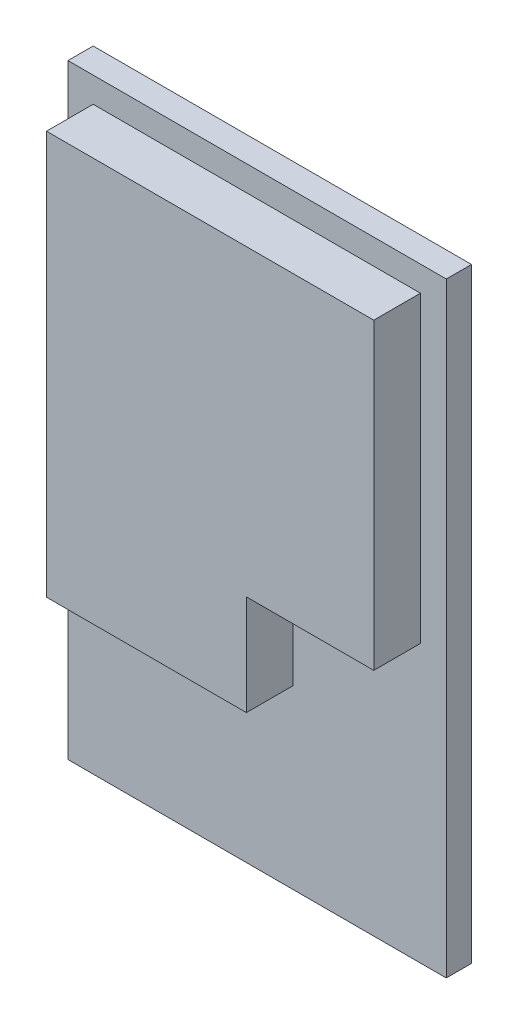
ISO-10303-21;
HEADER;
FILE_DESCRIPTION(('STEP AP214'),'2;1');
FILE_NAME('part.step','',(''),(''),'','','');
FILE_SCHEMA(('AUTOMOTIVE_DESIGN { 1 0 10303 214 1 1 1 1 }'));
ENDSEC;
DATA;
#1=APPLICATION_CONTEXT('core data for automotive mechanical design processes');
#2=APPLICATION_PROTOCOL_DEFINITION('international standard','automotive_design',2000,#1);
#3=PRODUCT_CONTEXT('',#1,'mechanical');
#4=PRODUCT('Part','Part','',(#3));
#5=PRODUCT_RELATED_PRODUCT_CATEGORY('part','',(#4));
#6=PRODUCT_DEFINITION_FORMATION('','',#4);
#7=PRODUCT_DEFINITION_CONTEXT('part definition',#1,'design');
#8=PRODUCT_DEFINITION('design','',#6,#7);
#9=PRODUCT_DEFINITION_SHAPE('','',#8);
#10=(LENGTH_UNIT() NAMED_UNIT(*) SI_UNIT(.MILLI.,.METRE.));
#11=(NAMED_UNIT(*) PLANE_ANGLE_UNIT() SI_UNIT($,.RADIAN.));
#12=(NAMED_UNIT(*) SI_UNIT($,.STERADIAN.) SOLID_ANGLE_UNIT());
#13=UNCERTAINTY_MEASURE_WITH_UNIT(LENGTH_MEASURE(1.E-05),#10,'distance_accuracy_value','');
#14=(GEOMETRIC_REPRESENTATION_CONTEXT(3) GLOBAL_UNCERTAINTY_ASSIGNED_CONTEXT((#13)) GLOBAL_UNIT_ASSIGNED_CONTEXT((#10,
#11,#12)) REPRESENTATION_CONTEXT('',''));
#15=CARTESIAN_POINT('',(0.,0.,0.));
#16=DIRECTION('',(0.,0.,1.));
#17=DIRECTION('',(1.,0.,0.));
#18=AXIS2_PLACEMENT_3D('',#15,#16,#17);
#19=CARTESIAN_POINT('',(-2.03199999981862E-05,2.69999714,0.));
#20=DIRECTION('',(0.,1.,0.));
#21=DIRECTION('',(1.,0.,0.));
#22=AXIS2_PLACEMENT_3D('',#19,#20,#21);
#23=PLANE('',#22);
#24=DIRECTION('',(0.,0.,1.));
#25=VECTOR('',#24,1.);
#26=CARTESIAN_POINT('',(-2.03199999981862E-05,2.69999714,0.));
#27=LINE('',#26,#25);
#28=CARTESIAN_POINT('',(-2.03199999981862E-05,2.69999714,0.));
#29=VERTEX_POINT('',#28);
#30=CARTESIAN_POINT('',(-2.03199999981862E-05,2.69999714,1.00000054));
#31=VERTEX_POINT('',#30);
#32=EDGE_CURVE('P0_E11',#29,#31,#27,.T.);
#33=ORIENTED_EDGE('',*,*,#32,.T.);
#34=DIRECTION('',(1.,0.,0.));
#35=VECTOR('',#34,1.);
#36=CARTESIAN_POINT('',(-2.03199999981862E-05,2.69999714,1.00000054));
#37=LINE('',#36,#35);
#38=CARTESIAN_POINT('',(14.99998016,2.69999714,1.00000054));
#39=VERTEX_POINT('',#38);
#40=EDGE_CURVE('P0_E23',#31,#39,#37,.T.);
#41=ORIENTED_EDGE('',*,*,#40,.T.);
#42=DIRECTION('',(0.,0.,1.));
#43=VECTOR('',#42,1.);
#44=CARTESIAN_POINT('',(14.99998016,2.69999714,0.));
#45=LINE('',#44,#43);
#46=CARTESIAN_POINT('',(14.99998016,2.69999714,0.));
#47=VERTEX_POINT('',#46);
#48=EDGE_CURVE('P0_E84',#47,#39,#45,.T.);
#49=ORIENTED_EDGE('',*,*,#48,.F.);
#50=DIRECTION('',(1.,0.,0.));
#51=VECTOR('',#50,1.);
#52=CARTESIAN_POINT('',(-2.03199999981862E-05,2.69999714,0.));
#53=LINE('',#52,#51);
#54=EDGE_CURVE('P0_E82',#29,#47,#53,.T.);
#55=ORIENTED_EDGE('',*,*,#54,.F.);
#56=EDGE_LOOP('',(#33,#41,#49,#55));
#57=FACE_BOUND('',#56,.T.);
#58=ADVANCED_FACE('P0_F16',(#57),#23,.T.);
#59=CARTESIAN_POINT('',(14.99998016,2.69999714,0.));
#60=DIRECTION('',(0.999999999999726,7.40833403898232E-07,0.));
#61=DIRECTION('',(7.40833403898232E-07,-0.999999999999726,0.));
#62=AXIS2_PLACEMENT_3D('',#59,#60,#61);
#63=PLANE('',#62);
#64=ORIENTED_EDGE('',*,*,#48,.T.);
#65=DIRECTION('',(7.40833403898232E-07,-0.999999999999726,0.));
#66=VECTOR('',#65,1.);
#67=CARTESIAN_POINT('',(14.99998016,2.69999714,1.00000054));
#68=LINE('',#67,#66);
#69=CARTESIAN_POINT('',(14.99999794,-21.30000058,1.00000054));
#70=VERTEX_POINT('',#69);
#71=EDGE_CURVE('P0_E80',#39,#70,#68,.T.);
#72=ORIENTED_EDGE('',*,*,#71,.T.);
#73=DIRECTION('',(0.,0.,1.));
#74=VECTOR('',#73,1.);
#75=CARTESIAN_POINT('',(14.99999794,-21.30000058,0.));
#76=LINE('',#75,#74);
#77=CARTESIAN_POINT('',(14.99999794,-21.30000058,0.));
#78=VERTEX_POINT('',#77);
#79=EDGE_CURVE('P0_E78',#78,#70,#76,.T.);
#80=ORIENTED_EDGE('',*,*,#79,.F.);
#81=DIRECTION('',(7.40833403898232E-07,-0.999999999999726,0.));
#82=VECTOR('',#81,1.);
#83=CARTESIAN_POINT('',(14.99998016,2.69999714,0.));
#84=LINE('',#83,#82);
#85=EDGE_CURVE('P0_E69',#47,#78,#84,.T.);
#86=ORIENTED_EDGE('',*,*,#85,.F.);
#87=EDGE_LOOP('',(#64,#72,#80,#86));
#88=FACE_BOUND('',#87,.T.);
#89=ADVANCED_FACE('P0_F89',(#88),#63,.T.);
#90=CARTESIAN_POINT('',(14.99999794,-21.30000058,0.));
#91=DIRECTION('',(0.,-1.,0.));
#92=DIRECTION('',(-1.,0.,0.));
#93=AXIS2_PLACEMENT_3D('',#90,#91,#92);
#94=PLANE('',#93);
#95=ORIENTED_EDGE('',*,*,#79,.T.);
#96=DIRECTION('',(-1.,0.,0.));
#97=VECTOR('',#96,1.);
#98=CARTESIAN_POINT('',(14.99999794,-21.30000058,1.00000054));
#99=LINE('',#98,#97);
#100=CARTESIAN_POINT('',(-2.54000000232679E-06,-21.30000058,1.00000054));
#101=VERTEX_POINT('',#100);
#102=EDGE_CURVE('P0_E59',#70,#101,#99,.T.);
#103=ORIENTED_EDGE('',*,*,#102,.T.);
#104=DIRECTION('',(0.,0.,1.));
#105=VECTOR('',#104,1.);
#106=CARTESIAN_POINT('',(-2.54000000232679E-06,-21.30000058,0.));
#107=LINE('',#106,#105);
#108=CARTESIAN_POINT('',(-2.54000000232679E-06,-21.30000058,0.));
#109=VERTEX_POINT('',#108);
#110=EDGE_CURVE('P0_E53',#109,#101,#107,.T.);
#111=ORIENTED_EDGE('',*,*,#110,.F.);
#112=DIRECTION('',(-1.,0.,0.));
#113=VECTOR('',#112,1.);
#114=CARTESIAN_POINT('',(14.99999794,-21.30000058,0.));
#115=LINE('',#114,#113);
#116=EDGE_CURVE('P0_E57',#78,#109,#115,.T.);
#117=ORIENTED_EDGE('',*,*,#116,.F.);
#118=EDGE_LOOP('',(#95,#103,#111,#117));
#119=FACE_BOUND('',#118,.T.);
#120=ADVANCED_FACE('P0_F56',(#119),#94,.T.);
#121=CARTESIAN_POINT('',(-2.54000000232679E-06,-21.30000058,0.));
#122=DIRECTION('',(-0.999999999999726,-7.40833403898232E-07,0.));
#123=DIRECTION('',(-7.40833403898232E-07,0.999999999999726,0.));
#124=AXIS2_PLACEMENT_3D('',#121,#122,#123);
#125=PLANE('',#124);
#126=ORIENTED_EDGE('',*,*,#110,.T.);
#127=DIRECTION('',(-7.40833403898232E-07,0.999999999999726,0.));
#128=VECTOR('',#127,1.);
#129=CARTESIAN_POINT('',(-2.54000000232679E-06,-21.30000058,1.00000054));
#130=LINE('',#129,#128);
#131=EDGE_CURVE('P0_E70',#101,#31,#130,.T.);
#132=ORIENTED_EDGE('',*,*,#131,.T.);
#133=ORIENTED_EDGE('',*,*,#32,.F.);
#134=DIRECTION('',(-7.40833403898232E-07,0.999999999999726,0.));
#135=VECTOR('',#134,1.);
#136=CARTESIAN_POINT('',(-2.54000000232679E-06,-21.30000058,0.));
#137=LINE('',#136,#135);
#138=EDGE_CURVE('P0_E67',#109,#29,#137,.T.);
#139=ORIENTED_EDGE('',*,*,#138,.F.);
#140=EDGE_LOOP('',(#126,#132,#133,#139));
#141=FACE_BOUND('',#140,.T.);
#142=ADVANCED_FACE('P0_F72',(#141),#125,.T.);
#143=CARTESIAN_POINT('',(7.49998881,-9.30000172,0.));
#144=DIRECTION('',(0.,0.,-1.));
#145=DIRECTION('',(1.,0.,0.));
#146=AXIS2_PLACEMENT_3D('',#143,#144,#145);
#147=PLANE('',#146);
#148=ORIENTED_EDGE('',*,*,#54,.T.);
#149=ORIENTED_EDGE('',*,*,#85,.T.);
#150=ORIENTED_EDGE('',*,*,#116,.T.);
#151=ORIENTED_EDGE('',*,*,#138,.T.);
#152=EDGE_LOOP('',(#148,#149,#150,#151));
#153=FACE_BOUND('',#152,.T.);
#154=ADVANCED_FACE('P0_F66',(#153),#147,.T.);
#155=CARTESIAN_POINT('',(7.49998881,-9.30000172,1.00000054));
#156=DIRECTION('',(0.,0.,-1.));
#157=DIRECTION('',(1.,0.,0.));
#158=AXIS2_PLACEMENT_3D('',#155,#156,#157);
#159=PLANE('',#158);
#160=ORIENTED_EDGE('',*,*,#131,.F.);
#161=ORIENTED_EDGE('',*,*,#102,.F.);
#162=ORIENTED_EDGE('',*,*,#71,.F.);
#163=ORIENTED_EDGE('',*,*,#40,.F.);
#164=EDGE_LOOP('',(#160,#161,#162,#163));
#165=FACE_BOUND('',#164,.T.);
#166=ADVANCED_FACE('P0_F90',(#165),#159,.F.);
#167=CLOSED_SHELL('',(#58,#89,#120,#142,#154,#166));
#168=MANIFOLD_SOLID_BREP('P0_B1',#167);
#169=CARTESIAN_POINT('',(0.99999546,1.6999966,1.00000054));
#170=DIRECTION('',(-1.95761067781132E-07,0.999999999999981,0.));
#171=DIRECTION('',(0.999999999999981,1.95761067781132E-07,0.));
#172=AXIS2_PLACEMENT_3D('',#169,#170,#171);
#173=PLANE('',#172);
#174=DIRECTION('',(0.,0.,1.));
#175=VECTOR('',#174,1.);
#176=CARTESIAN_POINT('',(0.99999546,1.6999966,1.00000054));
#177=LINE('',#176,#175);
#178=CARTESIAN_POINT('',(0.99999546,1.6999966,1.00000054));
#179=VERTEX_POINT('',#178);
#180=CARTESIAN_POINT('',(0.99999546,1.6999966,2.84999938));
#181=VERTEX_POINT('',#180);
#182=EDGE_CURVE('P1_E11',#179,#181,#177,.T.);
#183=ORIENTED_EDGE('',*,*,#182,.T.);
#184=DIRECTION('',(0.999999999999981,1.95761067781132E-07,0.));
#185=VECTOR('',#184,1.);
#186=CARTESIAN_POINT('',(0.99999546,1.6999966,2.84999938));
#187=LINE('',#186,#185);
#188=CARTESIAN_POINT('',(13.97499618,1.69999914,2.84999938));
#189=VERTEX_POINT('',#188);
#190=EDGE_CURVE('P1_E23',#181,#189,#187,.T.);
#191=ORIENTED_EDGE('',*,*,#190,.T.);
#192=DIRECTION('',(0.,0.,1.));
#193=VECTOR('',#192,1.);
#194=CARTESIAN_POINT('',(13.97499618,1.69999914,1.00000054));
#195=LINE('',#194,#193);
#196=CARTESIAN_POINT('',(13.97499618,1.69999914,1.00000054));
#197=VERTEX_POINT('',#196);
#198=EDGE_CURVE('P1_E112',#197,#189,#195,.T.);
#199=ORIENTED_EDGE('',*,*,#198,.F.);
#200=DIRECTION('',(0.999999999999981,1.95761067781132E-07,0.));
#201=VECTOR('',#200,1.);
#202=CARTESIAN_POINT('',(0.99999546,1.6999966,1.00000054));
#203=LINE('',#202,#201);
#204=EDGE_CURVE('P1_E110',#179,#197,#203,.T.);
#205=ORIENTED_EDGE('',*,*,#204,.F.);
#206=EDGE_LOOP('',(#183,#191,#199,#205));
#207=FACE_BOUND('',#206,.T.);
#208=ADVANCED_FACE('P1_F16',(#207),#173,.T.);
#209=CARTESIAN_POINT('',(13.97499618,1.69999914,1.00000054));
#210=DIRECTION('',(0.999999999999978,2.11226607085631E-07,0.));
#211=DIRECTION('',(2.11226607085631E-07,-0.999999999999978,0.));
#212=AXIS2_PLACEMENT_3D('',#209,#210,#211);
#213=PLANE('',#212);
#214=ORIENTED_EDGE('',*,*,#198,.T.);
#215=DIRECTION('',(2.11226607085631E-07,-0.999999999999978,0.));
#216=VECTOR('',#215,1.);
#217=CARTESIAN_POINT('',(13.97499618,1.69999914,2.84999938));
#218=LINE('',#217,#216);
#219=CARTESIAN_POINT('',(13.97499872,-10.32500094,2.84999938));
#220=VERTEX_POINT('',#219);
#221=EDGE_CURVE('P1_E108',#189,#220,#218,.T.);
#222=ORIENTED_EDGE('',*,*,#221,.T.);
#223=DIRECTION('',(0.,0.,1.));
#224=VECTOR('',#223,1.);
#225=CARTESIAN_POINT('',(13.97499872,-10.32500094,1.00000054));
#226=LINE('',#225,#224);
#227=CARTESIAN_POINT('',(13.97499872,-10.32500094,1.00000054));
#228=VERTEX_POINT('',#227);
#229=EDGE_CURVE('P1_E105',#228,#220,#226,.T.);
#230=ORIENTED_EDGE('',*,*,#229,.F.);
#231=DIRECTION('',(2.11226607085631E-07,-0.999999999999978,0.));
#232=VECTOR('',#231,1.);
#233=CARTESIAN_POINT('',(13.97499618,1.69999914,1.00000054));
#234=LINE('',#233,#232);
#235=EDGE_CURVE('P1_E102',#197,#228,#234,.T.);
#236=ORIENTED_EDGE('',*,*,#235,.F.);
#237=EDGE_LOOP('',(#214,#222,#230,#236));
#238=FACE_BOUND('',#237,.T.);
#239=ADVANCED_FACE('P1_F118',(#238),#213,.T.);
#240=CARTESIAN_POINT('',(13.97499872,-10.32500094,1.00000054));
#241=DIRECTION('',(0.,-1.,0.));
#242=DIRECTION('',(-1.,0.,0.));
#243=AXIS2_PLACEMENT_3D('',#240,#241,#242);
#244=PLANE('',#243);
#245=ORIENTED_EDGE('',*,*,#229,.T.);
#246=DIRECTION('',(-1.,0.,0.));
#247=VECTOR('',#246,1.);
#248=CARTESIAN_POINT('',(13.97499872,-10.32500094,2.84999938));
#249=LINE('',#248,#247);
#250=CARTESIAN_POINT('',(8.92499866,-10.32500094,2.84999938));
#251=VERTEX_POINT('',#250);
#252=EDGE_CURVE('P1_E99',#220,#251,#249,.T.);
#253=ORIENTED_EDGE('',*,*,#252,.T.);
#254=DIRECTION('',(0.,0.,1.));
#255=VECTOR('',#254,1.);
#256=CARTESIAN_POINT('',(8.92499866,-10.32500094,1.00000054));
#257=LINE('',#256,#255);
#258=CARTESIAN_POINT('',(8.92499866,-10.32500094,1.00000054));
#259=VERTEX_POINT('',#258);
#260=EDGE_CURVE('P1_E96',#259,#251,#257,.T.);
#261=ORIENTED_EDGE('',*,*,#260,.F.);
#262=DIRECTION('',(-1.,0.,0.));
#263=VECTOR('',#262,1.);
#264=CARTESIAN_POINT('',(13.97499872,-10.32500094,1.00000054));
#265=LINE('',#264,#263);
#266=EDGE_CURVE('P1_E94',#228,#259,#265,.T.);
#267=ORIENTED_EDGE('',*,*,#266,.F.);
#268=EDGE_LOOP('',(#245,#253,#261,#267));
#269=FACE_BOUND('',#268,.T.);
#270=ADVANCED_FACE('P1_F124',(#269),#244,.T.);
#271=CARTESIAN_POINT('',(8.92499866,-10.32500094,1.00000054));
#272=DIRECTION('',(1.,0.,0.));
#273=DIRECTION('',(0.,-1.,0.));
#274=AXIS2_PLACEMENT_3D('',#271,#272,#273);
#275=PLANE('',#274);
#276=ORIENTED_EDGE('',*,*,#260,.T.);
#277=DIRECTION('',(0.,-1.,0.));
#278=VECTOR('',#277,1.);
#279=CARTESIAN_POINT('',(8.92499866,-10.32500094,2.84999938));
#280=LINE('',#279,#278);
#281=CARTESIAN_POINT('',(8.92499866,-14.29999934,2.84999938));
#282=VERTEX_POINT('',#281);
#283=EDGE_CURVE('P1_E92',#251,#282,#280,.T.);
#284=ORIENTED_EDGE('',*,*,#283,.T.);
#285=DIRECTION('',(0.,0.,1.));
#286=VECTOR('',#285,1.);
#287=CARTESIAN_POINT('',(8.92499866,-14.29999934,1.00000054));
#288=LINE('',#287,#286);
#289=CARTESIAN_POINT('',(8.92499866,-14.29999934,1.00000054));
#290=VERTEX_POINT('',#289);
#291=EDGE_CURVE('P1_E90',#290,#282,#288,.T.);
#292=ORIENTED_EDGE('',*,*,#291,.F.);
#293=DIRECTION('',(0.,-1.,0.));
#294=VECTOR('',#293,1.);
#295=CARTESIAN_POINT('',(8.92499866,-10.32500094,1.00000054));
#296=LINE('',#295,#294);
#297=EDGE_CURVE('P1_E81',#259,#290,#296,.T.);
#298=ORIENTED_EDGE('',*,*,#297,.F.);
#299=EDGE_LOOP('',(#276,#284,#292,#298));
#300=FACE_BOUND('',#299,.T.);
#301=ADVANCED_FACE('P1_F126',(#300),#275,.T.);
#302=CARTESIAN_POINT('',(8.92499866,-14.29999934,1.00000054));
#303=DIRECTION('',(9.61513809664791E-07,-0.999999999999538,0.));
#304=DIRECTION('',(-0.999999999999538,-9.61513809664791E-07,0.));
#305=AXIS2_PLACEMENT_3D('',#302,#303,#304);
#306=PLANE('',#305);
#307=ORIENTED_EDGE('',*,*,#291,.T.);
#308=DIRECTION('',(-0.999999999999538,-9.61513809664791E-07,0.));
#309=VECTOR('',#308,1.);
#310=CARTESIAN_POINT('',(8.92499866,-14.29999934,2.84999938));
#311=LINE('',#310,#309);
#312=CARTESIAN_POINT('',(0.999995459999998,-14.30000696,2.84999938));
#313=VERTEX_POINT('',#312);
#314=EDGE_CURVE('P1_E71',#282,#313,#311,.T.);
#315=ORIENTED_EDGE('',*,*,#314,.T.);
#316=DIRECTION('',(0.,0.,1.));
#317=VECTOR('',#316,1.);
#318=CARTESIAN_POINT('',(0.999995459999998,-14.30000696,1.00000054));
#319=LINE('',#318,#317);
#320=CARTESIAN_POINT('',(0.999995459999998,-14.30000696,1.00000054));
#321=VERTEX_POINT('',#320);
#322=EDGE_CURVE('P1_E65',#321,#313,#319,.T.);
#323=ORIENTED_EDGE('',*,*,#322,.F.);
#324=DIRECTION('',(-0.999999999999538,-9.61513809664791E-07,0.));
#325=VECTOR('',#324,1.);
#326=CARTESIAN_POINT('',(8.92499866,-14.29999934,1.00000054));
#327=LINE('',#326,#325);
#328=EDGE_CURVE('P1_E69',#290,#321,#327,.T.);
#329=ORIENTED_EDGE('',*,*,#328,.F.);
#330=EDGE_LOOP('',(#307,#315,#323,#329));
#331=FACE_BOUND('',#330,.T.);
#332=ADVANCED_FACE('P1_F68',(#331),#306,.T.);
#333=CARTESIAN_POINT('',(0.999995459999998,-14.30000696,1.00000054));
#334=DIRECTION('',(-1.,0.,0.));
#335=DIRECTION('',(0.,1.,0.));
#336=AXIS2_PLACEMENT_3D('',#333,#334,#335);
#337=PLANE('',#336);
#338=ORIENTED_EDGE('',*,*,#322,.T.);
#339=DIRECTION('',(0.,1.,0.));
#340=VECTOR('',#339,1.);
#341=CARTESIAN_POINT('',(0.999995459999998,-14.30000696,2.84999938));
#342=LINE('',#341,#340);
#343=EDGE_CURVE('P1_E82',#313,#181,#342,.T.);
#344=ORIENTED_EDGE('',*,*,#343,.T.);
#345=ORIENTED_EDGE('',*,*,#182,.F.);
#346=DIRECTION('',(0.,1.,0.));
#347=VECTOR('',#346,1.);
#348=CARTESIAN_POINT('',(0.999995459999998,-14.30000696,1.00000054));
#349=LINE('',#348,#347);
#350=EDGE_CURVE('P1_E79',#321,#179,#349,.T.);
#351=ORIENTED_EDGE('',*,*,#350,.F.);
#352=EDGE_LOOP('',(#338,#344,#345,#351));
#353=FACE_BOUND('',#352,.T.);
#354=ADVANCED_FACE('P1_F84',(#353),#337,.T.);
#355=CARTESIAN_POINT('',(7.141098388021,-5.953605073242,1.00000054));
#356=DIRECTION('',(0.,0.,-1.));
#357=DIRECTION('',(1.,0.,0.));
#358=AXIS2_PLACEMENT_3D('',#355,#356,#357);
#359=PLANE('',#358);
#360=ORIENTED_EDGE('',*,*,#204,.T.);
#361=ORIENTED_EDGE('',*,*,#235,.T.);
#362=ORIENTED_EDGE('',*,*,#266,.T.);
#363=ORIENTED_EDGE('',*,*,#297,.T.);
#364=ORIENTED_EDGE('',*,*,#328,.T.);
#365=ORIENTED_EDGE('',*,*,#350,.T.);
#366=EDGE_LOOP('',(#360,#361,#362,#363,#364,#365));
#367=FACE_BOUND('',#366,.T.);
#368=ADVANCED_FACE('P1_F78',(#367),#359,.T.);
#369=CARTESIAN_POINT('',(7.141098388021,-5.953605073242,2.84999938));
#370=DIRECTION('',(0.,0.,-1.));
#371=DIRECTION('',(1.,0.,0.));
#372=AXIS2_PLACEMENT_3D('',#369,#370,#371);
#373=PLANE('',#372);
#374=ORIENTED_EDGE('',*,*,#343,.F.);
#375=ORIENTED_EDGE('',*,*,#314,.F.);
#376=ORIENTED_EDGE('',*,*,#283,.F.);
#377=ORIENTED_EDGE('',*,*,#252,.F.);
#378=ORIENTED_EDGE('',*,*,#221,.F.);
#379=ORIENTED_EDGE('',*,*,#190,.F.);
#380=EDGE_LOOP('',(#374,#375,#376,#377,#378,#379));
#381=FACE_BOUND('',#380,.T.);
#382=ADVANCED_FACE('P1_F121',(#381),#373,.F.);
#383=CLOSED_SHELL('',(#208,#239,#270,#301,#332,#354,#368,#382));
#384=MANIFOLD_SOLID_BREP('P1_B1',#383);
#385=ADVANCED_BREP_SHAPE_REPRESENTATION('',(#18,#168,#384),#14);
#386=SHAPE_DEFINITION_REPRESENTATION(#9,#385);
ENDSEC;
END-ISO-10303-21;
